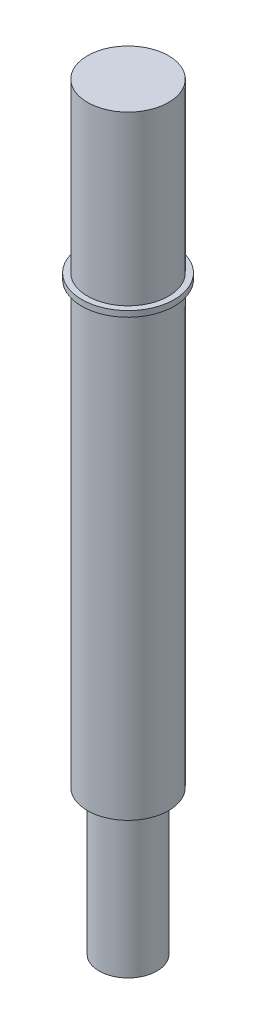
ISO-10303-21;
HEADER;
FILE_DESCRIPTION(('STEP AP214'),'2;1');
FILE_NAME('part.step','',(''),(''),'','','');
FILE_SCHEMA(('AUTOMOTIVE_DESIGN { 1 0 10303 214 1 1 1 1 }'));
ENDSEC;
DATA;
#1=APPLICATION_CONTEXT('core data for automotive mechanical design processes');
#2=APPLICATION_PROTOCOL_DEFINITION('international standard','automotive_design',2000,#1);
#3=PRODUCT_CONTEXT('',#1,'mechanical');
#4=PRODUCT('Part','Part','',(#3));
#5=PRODUCT_RELATED_PRODUCT_CATEGORY('part','',(#4));
#6=PRODUCT_DEFINITION_FORMATION('','',#4);
#7=PRODUCT_DEFINITION_CONTEXT('part definition',#1,'design');
#8=PRODUCT_DEFINITION('design','',#6,#7);
#9=PRODUCT_DEFINITION_SHAPE('','',#8);
#10=(LENGTH_UNIT() NAMED_UNIT(*) SI_UNIT(.MILLI.,.METRE.));
#11=(NAMED_UNIT(*) PLANE_ANGLE_UNIT() SI_UNIT($,.RADIAN.));
#12=(NAMED_UNIT(*) SI_UNIT($,.STERADIAN.) SOLID_ANGLE_UNIT());
#13=UNCERTAINTY_MEASURE_WITH_UNIT(LENGTH_MEASURE(1.E-05),#10,'distance_accuracy_value','');
#14=(GEOMETRIC_REPRESENTATION_CONTEXT(3) GLOBAL_UNCERTAINTY_ASSIGNED_CONTEXT((#13)) GLOBAL_UNIT_ASSIGNED_CONTEXT((#10,
#11,#12)) REPRESENTATION_CONTEXT('',''));
#15=CARTESIAN_POINT('',(0.,0.,0.));
#16=DIRECTION('',(0.,0.,1.));
#17=DIRECTION('',(1.,0.,0.));
#18=AXIS2_PLACEMENT_3D('',#15,#16,#17);
#19=CARTESIAN_POINT('',(0.,-33.274,0.));
#20=DIRECTION('',(0.,1.,0.));
#21=DIRECTION('',(0.,0.,1.));
#22=AXIS2_PLACEMENT_3D('',#19,#20,#21);
#23=PLANE('',#22);
#24=CARTESIAN_POINT('',(0.,-33.274,0.));
#25=DIRECTION('',(0.,-1.,0.));
#26=DIRECTION('',(0.,0.,-1.));
#27=AXIS2_PLACEMENT_3D('',#24,#25,#26);
#28=CIRCLE('',#27,1.27);
#29=CARTESIAN_POINT('',(0.,-33.274,-1.27));
#30=VERTEX_POINT('',#29);
#31=EDGE_CURVE('E10',#30,#30,#28,.T.);
#32=ORIENTED_EDGE('',*,*,#31,.T.);
#33=EDGE_LOOP('',(#32));
#34=FACE_BOUND('',#33,.T.);
#35=ADVANCED_FACE('F39',(#34),#23,.F.);
#36=CARTESIAN_POINT('',(0.,0.,0.));
#37=DIRECTION('',(0.,-1.,0.));
#38=DIRECTION('',(0.,0.,-1.));
#39=AXIS2_PLACEMENT_3D('',#36,#37,#38);
#40=CYLINDRICAL_SURFACE('',#39,1.27);
#41=ORIENTED_EDGE('',*,*,#31,.F.);
#42=EDGE_LOOP('',(#41));
#43=FACE_BOUND('',#42,.T.);
#44=CARTESIAN_POINT('',(0.,-26.924,0.));
#45=DIRECTION('',(0.,-1.,0.));
#46=DIRECTION('',(0.,0.,-1.));
#47=AXIS2_PLACEMENT_3D('',#44,#45,#46);
#48=CIRCLE('',#47,1.27);
#49=CARTESIAN_POINT('',(0.,-26.924,-1.27));
#50=VERTEX_POINT('',#49);
#51=EDGE_CURVE('E46',#50,#50,#48,.T.);
#52=ORIENTED_EDGE('',*,*,#51,.T.);
#53=EDGE_LOOP('',(#52));
#54=FACE_BOUND('',#53,.T.);
#55=ADVANCED_FACE('F92',(#43,#54),#40,.T.);
#56=CARTESIAN_POINT('',(0.,-26.924,0.));
#57=DIRECTION('',(0.,1.,0.));
#58=DIRECTION('',(0.,0.,1.));
#59=AXIS2_PLACEMENT_3D('',#56,#57,#58);
#60=PLANE('',#59);
#61=ORIENTED_EDGE('',*,*,#51,.F.);
#62=EDGE_LOOP('',(#61));
#63=FACE_BOUND('',#62,.T.);
#64=CARTESIAN_POINT('',(0.,-26.924,0.));
#65=DIRECTION('',(0.,-1.,0.));
#66=DIRECTION('',(0.,0.,-1.));
#67=AXIS2_PLACEMENT_3D('',#64,#65,#66);
#68=CIRCLE('',#67,1.778);
#69=CARTESIAN_POINT('',(0.,-26.924,-1.778));
#70=VERTEX_POINT('',#69);
#71=EDGE_CURVE('E51',#70,#70,#68,.T.);
#72=ORIENTED_EDGE('',*,*,#71,.T.);
#73=EDGE_LOOP('',(#72));
#74=FACE_BOUND('',#73,.T.);
#75=ADVANCED_FACE('F96',(#63,#74),#60,.F.);
#76=CARTESIAN_POINT('',(0.,0.,0.));
#77=DIRECTION('',(0.,-1.,0.));
#78=DIRECTION('',(0.,0.,-1.));
#79=AXIS2_PLACEMENT_3D('',#76,#77,#78);
#80=CYLINDRICAL_SURFACE('',#79,1.778);
#81=ORIENTED_EDGE('',*,*,#71,.F.);
#82=EDGE_LOOP('',(#81));
#83=FACE_BOUND('',#82,.T.);
#84=CARTESIAN_POINT('',(0.,-7.62,0.));
#85=DIRECTION('',(0.,-1.,0.));
#86=DIRECTION('',(0.,0.,-1.));
#87=AXIS2_PLACEMENT_3D('',#84,#85,#86);
#88=CIRCLE('',#87,1.778);
#89=CARTESIAN_POINT('',(0.,-7.62,-1.778));
#90=VERTEX_POINT('',#89);
#91=EDGE_CURVE('E56',#90,#90,#88,.T.);
#92=ORIENTED_EDGE('',*,*,#91,.T.);
#93=EDGE_LOOP('',(#92));
#94=FACE_BOUND('',#93,.T.);
#95=ADVANCED_FACE('F90',(#83,#94),#80,.T.);
#96=CARTESIAN_POINT('',(0.,-7.62,0.));
#97=DIRECTION('',(0.,1.,0.));
#98=DIRECTION('',(0.,0.,1.));
#99=AXIS2_PLACEMENT_3D('',#96,#97,#98);
#100=PLANE('',#99);
#101=ORIENTED_EDGE('',*,*,#91,.F.);
#102=EDGE_LOOP('',(#101));
#103=FACE_BOUND('',#102,.T.);
#104=CARTESIAN_POINT('',(0.,-7.62,0.));
#105=DIRECTION('',(0.,-1.,0.));
#106=DIRECTION('',(0.,0.,-1.));
#107=AXIS2_PLACEMENT_3D('',#104,#105,#106);
#108=CIRCLE('',#107,2.032);
#109=CARTESIAN_POINT('',(0.,-7.62,-2.032));
#110=VERTEX_POINT('',#109);
#111=EDGE_CURVE('E62',#110,#110,#108,.T.);
#112=ORIENTED_EDGE('',*,*,#111,.T.);
#113=EDGE_LOOP('',(#112));
#114=FACE_BOUND('',#113,.T.);
#115=ADVANCED_FACE('F104',(#103,#114),#100,.F.);
#116=CARTESIAN_POINT('',(0.,0.,0.));
#117=DIRECTION('',(0.,-1.,0.));
#118=DIRECTION('',(0.,0.,-1.));
#119=AXIS2_PLACEMENT_3D('',#116,#117,#118);
#120=CYLINDRICAL_SURFACE('',#119,2.032);
#121=ORIENTED_EDGE('',*,*,#111,.F.);
#122=EDGE_LOOP('',(#121));
#123=FACE_BOUND('',#122,.T.);
#124=CARTESIAN_POINT('',(0.,-7.366,0.));
#125=DIRECTION('',(0.,-1.,0.));
#126=DIRECTION('',(0.,0.,-1.));
#127=AXIS2_PLACEMENT_3D('',#124,#125,#126);
#128=CIRCLE('',#127,2.032);
#129=CARTESIAN_POINT('',(0.,-7.366,-2.032));
#130=VERTEX_POINT('',#129);
#131=EDGE_CURVE('E66',#130,#130,#128,.T.);
#132=ORIENTED_EDGE('',*,*,#131,.T.);
#133=EDGE_LOOP('',(#132));
#134=FACE_BOUND('',#133,.T.);
#135=ADVANCED_FACE('F107',(#123,#134),#120,.T.);
#136=CARTESIAN_POINT('',(0.,-7.366,0.));
#137=DIRECTION('',(0.,-1.,0.));
#138=DIRECTION('',(0.,0.,-1.));
#139=AXIS2_PLACEMENT_3D('',#136,#137,#138);
#140=PLANE('',#139);
#141=ORIENTED_EDGE('',*,*,#131,.F.);
#142=EDGE_LOOP('',(#141));
#143=FACE_BOUND('',#142,.T.);
#144=CARTESIAN_POINT('',(0.,-7.366,0.));
#145=DIRECTION('',(0.,-1.,0.));
#146=DIRECTION('',(0.,0.,-1.));
#147=AXIS2_PLACEMENT_3D('',#144,#145,#146);
#148=CIRCLE('',#147,1.778);
#149=CARTESIAN_POINT('',(0.,-7.366,-1.778));
#150=VERTEX_POINT('',#149);
#151=EDGE_CURVE('E70',#150,#150,#148,.T.);
#152=ORIENTED_EDGE('',*,*,#151,.T.);
#153=EDGE_LOOP('',(#152));
#154=FACE_BOUND('',#153,.T.);
#155=ADVANCED_FACE('F87',(#143,#154),#140,.F.);
#156=ORIENTED_EDGE('',*,*,#151,.F.);
#157=EDGE_LOOP('',(#156));
#158=FACE_BOUND('',#157,.T.);
#159=CARTESIAN_POINT('',(0.,0.,0.));
#160=DIRECTION('',(0.,-1.,0.));
#161=DIRECTION('',(0.,0.,-1.));
#162=AXIS2_PLACEMENT_3D('',#159,#160,#161);
#163=CIRCLE('',#162,1.778);
#164=CARTESIAN_POINT('',(0.,0.,-1.778));
#165=VERTEX_POINT('',#164);
#166=EDGE_CURVE('E74',#165,#165,#163,.T.);
#167=ORIENTED_EDGE('',*,*,#166,.T.);
#168=EDGE_LOOP('',(#167));
#169=FACE_BOUND('',#168,.T.);
#170=ADVANCED_FACE('F79',(#158,#169),#80,.T.);
#171=CARTESIAN_POINT('',(0.,0.,0.));
#172=DIRECTION('',(0.,-1.,0.));
#173=DIRECTION('',(0.,0.,-1.));
#174=AXIS2_PLACEMENT_3D('',#171,#172,#173);
#175=PLANE('',#174);
#176=ORIENTED_EDGE('',*,*,#166,.F.);
#177=EDGE_LOOP('',(#176));
#178=FACE_BOUND('',#177,.T.);
#179=ADVANCED_FACE('F81',(#178),#175,.F.);
#180=CLOSED_SHELL('',(#35,#55,#75,#95,#115,#135,#155,#170,#179));
#181=MANIFOLD_SOLID_BREP('B2',#180);
#182=ADVANCED_BREP_SHAPE_REPRESENTATION('',(#18,#181),#14);
#183=SHAPE_DEFINITION_REPRESENTATION(#9,#182);
ENDSEC;
END-ISO-10303-21;
